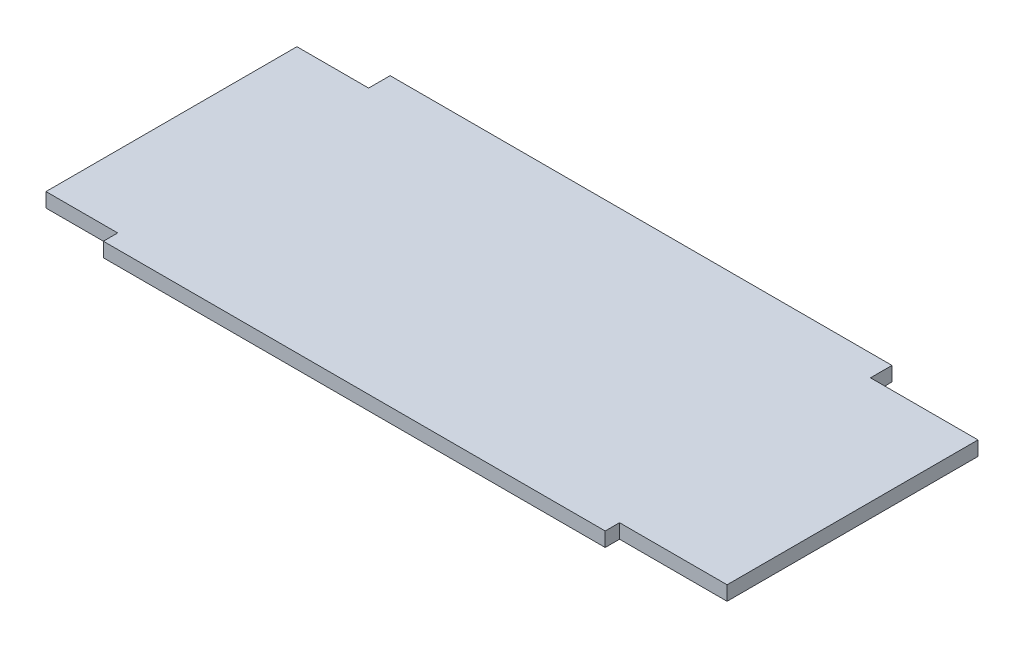
ISO-10303-21;
HEADER;
FILE_DESCRIPTION(('STEP AP214'),'2;1');
FILE_NAME('part.step','',(''),(''),'','','');
FILE_SCHEMA(('AUTOMOTIVE_DESIGN { 1 0 10303 214 1 1 1 1 }'));
ENDSEC;
DATA;
#1=APPLICATION_CONTEXT('core data for automotive mechanical design processes');
#2=APPLICATION_PROTOCOL_DEFINITION('international standard','automotive_design',2000,#1);
#3=PRODUCT_CONTEXT('',#1,'mechanical');
#4=PRODUCT('Part','Part','',(#3));
#5=PRODUCT_RELATED_PRODUCT_CATEGORY('part','',(#4));
#6=PRODUCT_DEFINITION_FORMATION('','',#4);
#7=PRODUCT_DEFINITION_CONTEXT('part definition',#1,'design');
#8=PRODUCT_DEFINITION('design','',#6,#7);
#9=PRODUCT_DEFINITION_SHAPE('','',#8);
#10=(LENGTH_UNIT() NAMED_UNIT(*) SI_UNIT(.MILLI.,.METRE.));
#11=(NAMED_UNIT(*) PLANE_ANGLE_UNIT() SI_UNIT($,.RADIAN.));
#12=(NAMED_UNIT(*) SI_UNIT($,.STERADIAN.) SOLID_ANGLE_UNIT());
#13=UNCERTAINTY_MEASURE_WITH_UNIT(LENGTH_MEASURE(1.E-05),#10,'distance_accuracy_value','');
#14=(GEOMETRIC_REPRESENTATION_CONTEXT(3) GLOBAL_UNCERTAINTY_ASSIGNED_CONTEXT((#13)) GLOBAL_UNIT_ASSIGNED_CONTEXT((#10,
#11,#12)) REPRESENTATION_CONTEXT('',''));
#15=CARTESIAN_POINT('',(0.,0.,0.));
#16=DIRECTION('',(0.,0.,1.));
#17=DIRECTION('',(1.,0.,0.));
#18=AXIS2_PLACEMENT_3D('',#15,#16,#17);
#19=CARTESIAN_POINT('',(78.,-72.5,107.028565600046));
#20=DIRECTION('',(1.,0.,0.));
#21=DIRECTION('',(0.,0.,-1.));
#22=AXIS2_PLACEMENT_3D('',#19,#20,#21);
#23=PLANE('',#22);
#24=DIRECTION('',(0.,-1.,0.));
#25=VECTOR('',#24,1.);
#26=CARTESIAN_POINT('',(78.,-72.5,0.));
#27=LINE('',#26,#25);
#28=CARTESIAN_POINT('',(78.,-72.5,0.));
#29=VERTEX_POINT('',#28);
#30=CARTESIAN_POINT('',(78.,-74.5,0.));
#31=VERTEX_POINT('',#30);
#32=EDGE_CURVE('E156',#29,#31,#27,.T.);
#33=ORIENTED_EDGE('',*,*,#32,.F.);
#34=DIRECTION('',(0.,0.,-1.));
#35=VECTOR('',#34,1.);
#36=CARTESIAN_POINT('',(78.,-72.5,107.028565600046));
#37=LINE('',#36,#35);
#38=CARTESIAN_POINT('',(78.,-72.5,-3.));
#39=VERTEX_POINT('',#38);
#40=EDGE_CURVE('E196',#29,#39,#37,.T.);
#41=ORIENTED_EDGE('',*,*,#40,.T.);
#42=DIRECTION('',(0.,1.,0.));
#43=VECTOR('',#42,1.);
#44=CARTESIAN_POINT('',(78.,-72.5,-3.));
#45=LINE('',#44,#43);
#46=CARTESIAN_POINT('',(78.,-74.5,-3.));
#47=VERTEX_POINT('',#46);
#48=EDGE_CURVE('E206',#47,#39,#45,.T.);
#49=ORIENTED_EDGE('',*,*,#48,.F.);
#50=DIRECTION('',(0.,0.,-1.));
#51=VECTOR('',#50,1.);
#52=CARTESIAN_POINT('',(78.,-74.5,107.028565600046));
#53=LINE('',#52,#51);
#54=EDGE_CURVE('E56',#31,#47,#53,.T.);
#55=ORIENTED_EDGE('',*,*,#54,.F.);
#56=EDGE_LOOP('',(#33,#41,#49,#55));
#57=FACE_BOUND('',#56,.T.);
#58=ADVANCED_FACE('F39',(#57),#23,.F.);
#59=DIRECTION('',(0.,1.,0.));
#60=VECTOR('',#59,1.);
#61=CARTESIAN_POINT('',(78.,-72.5,35.));
#62=LINE('',#61,#60);
#63=CARTESIAN_POINT('',(78.,-74.5,35.));
#64=VERTEX_POINT('',#63);
#65=CARTESIAN_POINT('',(78.,-72.5,35.));
#66=VERTEX_POINT('',#65);
#67=EDGE_CURVE('E64',#64,#66,#62,.T.);
#68=ORIENTED_EDGE('',*,*,#67,.F.);
#69=CARTESIAN_POINT('',(78.,-74.5,37.));
#70=VERTEX_POINT('',#69);
#71=EDGE_CURVE('E210',#70,#64,#53,.T.);
#72=ORIENTED_EDGE('',*,*,#71,.F.);
#73=DIRECTION('',(0.,-1.,0.));
#74=VECTOR('',#73,1.);
#75=CARTESIAN_POINT('',(78.,-72.5,37.));
#76=LINE('',#75,#74);
#77=CARTESIAN_POINT('',(78.,-72.5,37.));
#78=VERTEX_POINT('',#77);
#79=EDGE_CURVE('E230',#78,#70,#76,.T.);
#80=ORIENTED_EDGE('',*,*,#79,.F.);
#81=EDGE_CURVE('E200',#78,#66,#37,.T.);
#82=ORIENTED_EDGE('',*,*,#81,.T.);
#83=EDGE_LOOP('',(#68,#72,#80,#82));
#84=FACE_BOUND('',#83,.T.);
#85=ADVANCED_FACE('F299',(#84),#23,.F.);
#86=CARTESIAN_POINT('',(148.,-72.5,107.028565600046));
#87=DIRECTION('',(-1.,0.,0.));
#88=DIRECTION('',(0.,0.,1.));
#89=AXIS2_PLACEMENT_3D('',#86,#87,#88);
#90=PLANE('',#89);
#91=DIRECTION('',(0.,1.,0.));
#92=VECTOR('',#91,1.);
#93=CARTESIAN_POINT('',(148.,-72.5,0.));
#94=LINE('',#93,#92);
#95=CARTESIAN_POINT('',(148.,-74.5,0.));
#96=VERTEX_POINT('',#95);
#97=CARTESIAN_POINT('',(148.,-72.5,0.));
#98=VERTEX_POINT('',#97);
#99=EDGE_CURVE('E157',#96,#98,#94,.T.);
#100=ORIENTED_EDGE('',*,*,#99,.F.);
#101=DIRECTION('',(0.,0.,-1.));
#102=VECTOR('',#101,1.);
#103=CARTESIAN_POINT('',(148.,-74.5,107.028565600046));
#104=LINE('',#103,#102);
#105=CARTESIAN_POINT('',(148.,-74.5,-3.));
#106=VERTEX_POINT('',#105);
#107=EDGE_CURVE('E220',#96,#106,#104,.T.);
#108=ORIENTED_EDGE('',*,*,#107,.T.);
#109=DIRECTION('',(0.,-1.,0.));
#110=VECTOR('',#109,1.);
#111=CARTESIAN_POINT('',(148.,-72.5,-3.));
#112=LINE('',#111,#110);
#113=CARTESIAN_POINT('',(148.,-72.5,-3.));
#114=VERTEX_POINT('',#113);
#115=EDGE_CURVE('E239',#114,#106,#112,.T.);
#116=ORIENTED_EDGE('',*,*,#115,.F.);
#117=DIRECTION('',(0.,0.,-1.));
#118=VECTOR('',#117,1.);
#119=CARTESIAN_POINT('',(148.,-72.5,107.028565600046));
#120=LINE('',#119,#118);
#121=EDGE_CURVE('E219',#98,#114,#120,.T.);
#122=ORIENTED_EDGE('',*,*,#121,.F.);
#123=EDGE_LOOP('',(#100,#108,#116,#122));
#124=FACE_BOUND('',#123,.T.);
#125=ADVANCED_FACE('F303',(#124),#90,.F.);
#126=DIRECTION('',(0.,-1.,0.));
#127=VECTOR('',#126,1.);
#128=CARTESIAN_POINT('',(148.,-72.5,35.));
#129=LINE('',#128,#127);
#130=CARTESIAN_POINT('',(148.,-72.5,35.));
#131=VERTEX_POINT('',#130);
#132=CARTESIAN_POINT('',(148.,-74.5,35.));
#133=VERTEX_POINT('',#132);
#134=EDGE_CURVE('E161',#131,#133,#129,.T.);
#135=ORIENTED_EDGE('',*,*,#134,.F.);
#136=CARTESIAN_POINT('',(148.,-72.5,37.));
#137=VERTEX_POINT('',#136);
#138=EDGE_CURVE('E231',#137,#131,#120,.T.);
#139=ORIENTED_EDGE('',*,*,#138,.F.);
#140=DIRECTION('',(0.,1.,0.));
#141=VECTOR('',#140,1.);
#142=CARTESIAN_POINT('',(148.,-72.5,37.));
#143=LINE('',#142,#141);
#144=CARTESIAN_POINT('',(148.,-74.5,37.));
#145=VERTEX_POINT('',#144);
#146=EDGE_CURVE('E11',#145,#137,#143,.T.);
#147=ORIENTED_EDGE('',*,*,#146,.F.);
#148=EDGE_CURVE('E216',#145,#133,#104,.T.);
#149=ORIENTED_EDGE('',*,*,#148,.T.);
#150=EDGE_LOOP('',(#135,#139,#147,#149));
#151=FACE_BOUND('',#150,.T.);
#152=ADVANCED_FACE('F307',(#151),#90,.F.);
#153=CARTESIAN_POINT('',(78.,-74.5,107.028565600046));
#154=DIRECTION('',(0.,1.,0.));
#155=DIRECTION('',(0.,0.,1.));
#156=AXIS2_PLACEMENT_3D('',#153,#154,#155);
#157=PLANE('',#156);
#158=DIRECTION('',(1.,0.,0.));
#159=VECTOR('',#158,1.);
#160=CARTESIAN_POINT('',(78.,-74.5,37.));
#161=LINE('',#160,#159);
#162=EDGE_CURVE('E48',#70,#145,#161,.T.);
#163=ORIENTED_EDGE('',*,*,#162,.F.);
#164=ORIENTED_EDGE('',*,*,#71,.T.);
#165=DIRECTION('',(1.,0.,0.));
#166=VECTOR('',#165,1.);
#167=CARTESIAN_POINT('',(68.,-74.5,35.));
#168=LINE('',#167,#166);
#169=CARTESIAN_POINT('',(68.,-74.5,35.));
#170=VERTEX_POINT('',#169);
#171=EDGE_CURVE('E141',#170,#64,#168,.T.);
#172=ORIENTED_EDGE('',*,*,#171,.F.);
#173=DIRECTION('',(0.,0.,1.));
#174=VECTOR('',#173,1.);
#175=CARTESIAN_POINT('',(68.,-74.5,0.));
#176=LINE('',#175,#174);
#177=CARTESIAN_POINT('',(68.,-74.5,0.));
#178=VERTEX_POINT('',#177);
#179=EDGE_CURVE('E134',#178,#170,#176,.T.);
#180=ORIENTED_EDGE('',*,*,#179,.F.);
#181=DIRECTION('',(1.,0.,0.));
#182=VECTOR('',#181,1.);
#183=CARTESIAN_POINT('',(68.,-74.5,0.));
#184=LINE('',#183,#182);
#185=EDGE_CURVE('E138',#178,#31,#184,.T.);
#186=ORIENTED_EDGE('',*,*,#185,.T.);
#187=ORIENTED_EDGE('',*,*,#54,.T.);
#188=DIRECTION('',(-1.,0.,0.));
#189=VECTOR('',#188,1.);
#190=CARTESIAN_POINT('',(78.,-74.5,-3.));
#191=LINE('',#190,#189);
#192=EDGE_CURVE('E201',#106,#47,#191,.T.);
#193=ORIENTED_EDGE('',*,*,#192,.F.);
#194=ORIENTED_EDGE('',*,*,#107,.F.);
#195=DIRECTION('',(-1.,0.,0.));
#196=VECTOR('',#195,1.);
#197=CARTESIAN_POINT('',(163.,-74.5,0.));
#198=LINE('',#197,#196);
#199=CARTESIAN_POINT('',(163.,-74.5,0.));
#200=VERTEX_POINT('',#199);
#201=EDGE_CURVE('E256',#200,#96,#198,.T.);
#202=ORIENTED_EDGE('',*,*,#201,.F.);
#203=DIRECTION('',(0.,0.,-1.));
#204=VECTOR('',#203,1.);
#205=CARTESIAN_POINT('',(163.,-74.5,0.));
#206=LINE('',#205,#204);
#207=CARTESIAN_POINT('',(163.,-74.5,35.));
#208=VERTEX_POINT('',#207);
#209=EDGE_CURVE('E270',#208,#200,#206,.T.);
#210=ORIENTED_EDGE('',*,*,#209,.F.);
#211=DIRECTION('',(-1.,0.,0.));
#212=VECTOR('',#211,1.);
#213=CARTESIAN_POINT('',(163.,-74.5,35.));
#214=LINE('',#213,#212);
#215=EDGE_CURVE('E252',#208,#133,#214,.T.);
#216=ORIENTED_EDGE('',*,*,#215,.T.);
#217=ORIENTED_EDGE('',*,*,#148,.F.);
#218=EDGE_LOOP('',(#163,#164,#172,#180,#186,#187,#193,#194,#202,#210,#216,#217));
#219=FACE_BOUND('',#218,.T.);
#220=ADVANCED_FACE('F136',(#219),#157,.F.);
#221=CARTESIAN_POINT('',(78.,-72.5,107.028565600046));
#222=DIRECTION('',(0.,-1.,0.));
#223=DIRECTION('',(1.,0.,0.));
#224=AXIS2_PLACEMENT_3D('',#221,#222,#223);
#225=PLANE('',#224);
#226=DIRECTION('',(-1.,0.,0.));
#227=VECTOR('',#226,1.);
#228=CARTESIAN_POINT('',(78.,-72.5,37.));
#229=LINE('',#228,#227);
#230=EDGE_CURVE('E226',#137,#78,#229,.T.);
#231=ORIENTED_EDGE('',*,*,#230,.F.);
#232=ORIENTED_EDGE('',*,*,#138,.T.);
#233=DIRECTION('',(-1.,0.,0.));
#234=VECTOR('',#233,1.);
#235=CARTESIAN_POINT('',(163.,-72.5,35.));
#236=LINE('',#235,#234);
#237=CARTESIAN_POINT('',(163.,-72.5,35.));
#238=VERTEX_POINT('',#237);
#239=EDGE_CURVE('E255',#238,#131,#236,.T.);
#240=ORIENTED_EDGE('',*,*,#239,.F.);
#241=DIRECTION('',(0.,0.,1.));
#242=VECTOR('',#241,1.);
#243=CARTESIAN_POINT('',(163.,-72.5,0.));
#244=LINE('',#243,#242);
#245=CARTESIAN_POINT('',(163.,-72.5,0.));
#246=VERTEX_POINT('',#245);
#247=EDGE_CURVE('E279',#246,#238,#244,.T.);
#248=ORIENTED_EDGE('',*,*,#247,.F.);
#249=DIRECTION('',(-1.,0.,0.));
#250=VECTOR('',#249,1.);
#251=CARTESIAN_POINT('',(163.,-72.5,0.));
#252=LINE('',#251,#250);
#253=EDGE_CURVE('E243',#246,#98,#252,.T.);
#254=ORIENTED_EDGE('',*,*,#253,.T.);
#255=ORIENTED_EDGE('',*,*,#121,.T.);
#256=DIRECTION('',(1.,0.,0.));
#257=VECTOR('',#256,1.);
#258=CARTESIAN_POINT('',(78.,-72.5,-3.));
#259=LINE('',#258,#257);
#260=EDGE_CURVE('E198',#39,#114,#259,.T.);
#261=ORIENTED_EDGE('',*,*,#260,.F.);
#262=ORIENTED_EDGE('',*,*,#40,.F.);
#263=DIRECTION('',(1.,0.,0.));
#264=VECTOR('',#263,1.);
#265=CARTESIAN_POINT('',(68.,-72.5,0.));
#266=LINE('',#265,#264);
#267=CARTESIAN_POINT('',(68.,-72.5,0.));
#268=VERTEX_POINT('',#267);
#269=EDGE_CURVE('E171',#268,#29,#266,.T.);
#270=ORIENTED_EDGE('',*,*,#269,.F.);
#271=DIRECTION('',(0.,0.,-1.));
#272=VECTOR('',#271,1.);
#273=CARTESIAN_POINT('',(68.,-72.5,0.));
#274=LINE('',#273,#272);
#275=CARTESIAN_POINT('',(68.,-72.5,35.));
#276=VERTEX_POINT('',#275);
#277=EDGE_CURVE('E150',#276,#268,#274,.T.);
#278=ORIENTED_EDGE('',*,*,#277,.F.);
#279=DIRECTION('',(1.,0.,0.));
#280=VECTOR('',#279,1.);
#281=CARTESIAN_POINT('',(68.,-72.5,35.));
#282=LINE('',#281,#280);
#283=EDGE_CURVE('E163',#276,#66,#282,.T.);
#284=ORIENTED_EDGE('',*,*,#283,.T.);
#285=ORIENTED_EDGE('',*,*,#81,.F.);
#286=EDGE_LOOP('',(#231,#232,#240,#248,#254,#255,#261,#262,#270,#278,#284,#285));
#287=FACE_BOUND('',#286,.T.);
#288=ADVANCED_FACE('F193',(#287),#225,.F.);
#289=CARTESIAN_POINT('',(144.,0.,37.));
#290=DIRECTION('',(0.,0.,1.));
#291=DIRECTION('',(-1.,0.,0.));
#292=AXIS2_PLACEMENT_3D('',#289,#290,#291);
#293=PLANE('',#292);
#294=ORIENTED_EDGE('',*,*,#230,.T.);
#295=ORIENTED_EDGE('',*,*,#79,.T.);
#296=ORIENTED_EDGE('',*,*,#162,.T.);
#297=ORIENTED_EDGE('',*,*,#146,.T.);
#298=EDGE_LOOP('',(#294,#295,#296,#297));
#299=FACE_BOUND('',#298,.T.);
#300=ADVANCED_FACE('F41',(#299),#293,.T.);
#301=CARTESIAN_POINT('',(0.,0.,-3.));
#302=DIRECTION('',(0.,0.,1.));
#303=DIRECTION('',(0.,-1.,0.));
#304=AXIS2_PLACEMENT_3D('',#301,#302,#303);
#305=PLANE('',#304);
#306=ORIENTED_EDGE('',*,*,#48,.T.);
#307=ORIENTED_EDGE('',*,*,#260,.T.);
#308=ORIENTED_EDGE('',*,*,#115,.T.);
#309=ORIENTED_EDGE('',*,*,#192,.T.);
#310=EDGE_LOOP('',(#306,#307,#308,#309));
#311=FACE_BOUND('',#310,.T.);
#312=ADVANCED_FACE('F297',(#311),#305,.F.);
#313=CARTESIAN_POINT('',(163.,-72.5,0.));
#314=DIRECTION('',(0.,0.,1.));
#315=DIRECTION('',(0.,-1.,0.));
#316=AXIS2_PLACEMENT_3D('',#313,#314,#315);
#317=PLANE('',#316);
#318=ORIENTED_EDGE('',*,*,#99,.T.);
#319=ORIENTED_EDGE('',*,*,#253,.F.);
#320=DIRECTION('',(0.,1.,0.));
#321=VECTOR('',#320,1.);
#322=CARTESIAN_POINT('',(163.,-72.5,0.));
#323=LINE('',#322,#321);
#324=EDGE_CURVE('E178',#200,#246,#323,.T.);
#325=ORIENTED_EDGE('',*,*,#324,.F.);
#326=ORIENTED_EDGE('',*,*,#201,.T.);
#327=EDGE_LOOP('',(#318,#319,#325,#326));
#328=FACE_BOUND('',#327,.T.);
#329=ADVANCED_FACE('F284',(#328),#317,.F.);
#330=CARTESIAN_POINT('',(163.,-72.5,35.));
#331=DIRECTION('',(0.,0.,-1.));
#332=DIRECTION('',(-1.,0.,0.));
#333=AXIS2_PLACEMENT_3D('',#330,#331,#332);
#334=PLANE('',#333);
#335=ORIENTED_EDGE('',*,*,#134,.T.);
#336=ORIENTED_EDGE('',*,*,#215,.F.);
#337=DIRECTION('',(0.,-1.,0.));
#338=VECTOR('',#337,1.);
#339=CARTESIAN_POINT('',(163.,-72.5,35.));
#340=LINE('',#339,#338);
#341=EDGE_CURVE('E275',#238,#208,#340,.T.);
#342=ORIENTED_EDGE('',*,*,#341,.F.);
#343=ORIENTED_EDGE('',*,*,#239,.T.);
#344=EDGE_LOOP('',(#335,#336,#342,#343));
#345=FACE_BOUND('',#344,.T.);
#346=ADVANCED_FACE('F289',(#345),#334,.F.);
#347=CARTESIAN_POINT('',(163.,0.,0.));
#348=DIRECTION('',(-1.,0.,0.));
#349=DIRECTION('',(0.,0.,1.));
#350=AXIS2_PLACEMENT_3D('',#347,#348,#349);
#351=PLANE('',#350);
#352=ORIENTED_EDGE('',*,*,#324,.T.);
#353=ORIENTED_EDGE('',*,*,#247,.T.);
#354=ORIENTED_EDGE('',*,*,#341,.T.);
#355=ORIENTED_EDGE('',*,*,#209,.T.);
#356=EDGE_LOOP('',(#352,#353,#354,#355));
#357=FACE_BOUND('',#356,.T.);
#358=ADVANCED_FACE('F283',(#357),#351,.F.);
#359=CARTESIAN_POINT('',(68.,-72.5,0.));
#360=DIRECTION('',(0.,0.,1.));
#361=DIRECTION('',(0.,-1.,0.));
#362=AXIS2_PLACEMENT_3D('',#359,#360,#361);
#363=PLANE('',#362);
#364=ORIENTED_EDGE('',*,*,#32,.T.);
#365=ORIENTED_EDGE('',*,*,#185,.F.);
#366=DIRECTION('',(0.,-1.,0.));
#367=VECTOR('',#366,1.);
#368=CARTESIAN_POINT('',(68.,-72.5,0.));
#369=LINE('',#368,#367);
#370=EDGE_CURVE('E145',#268,#178,#369,.T.);
#371=ORIENTED_EDGE('',*,*,#370,.F.);
#372=ORIENTED_EDGE('',*,*,#269,.T.);
#373=EDGE_LOOP('',(#364,#365,#371,#372));
#374=FACE_BOUND('',#373,.T.);
#375=ADVANCED_FACE('F155',(#374),#363,.F.);
#376=CARTESIAN_POINT('',(68.,-72.5,35.));
#377=DIRECTION('',(0.,0.,-1.));
#378=DIRECTION('',(-1.,0.,0.));
#379=AXIS2_PLACEMENT_3D('',#376,#377,#378);
#380=PLANE('',#379);
#381=ORIENTED_EDGE('',*,*,#67,.T.);
#382=ORIENTED_EDGE('',*,*,#283,.F.);
#383=DIRECTION('',(0.,1.,0.));
#384=VECTOR('',#383,1.);
#385=CARTESIAN_POINT('',(68.,-72.5,35.));
#386=LINE('',#385,#384);
#387=EDGE_CURVE('E144',#170,#276,#386,.T.);
#388=ORIENTED_EDGE('',*,*,#387,.F.);
#389=ORIENTED_EDGE('',*,*,#171,.T.);
#390=EDGE_LOOP('',(#381,#382,#388,#389));
#391=FACE_BOUND('',#390,.T.);
#392=ADVANCED_FACE('F191',(#391),#380,.F.);
#393=CARTESIAN_POINT('',(68.,0.,0.));
#394=DIRECTION('',(-1.,0.,0.));
#395=DIRECTION('',(0.,0.,1.));
#396=AXIS2_PLACEMENT_3D('',#393,#394,#395);
#397=PLANE('',#396);
#398=ORIENTED_EDGE('',*,*,#370,.T.);
#399=ORIENTED_EDGE('',*,*,#179,.T.);
#400=ORIENTED_EDGE('',*,*,#387,.T.);
#401=ORIENTED_EDGE('',*,*,#277,.T.);
#402=EDGE_LOOP('',(#398,#399,#400,#401));
#403=FACE_BOUND('',#402,.T.);
#404=ADVANCED_FACE('F148',(#403),#397,.T.);
#405=CLOSED_SHELL('',(#58,#85,#125,#152,#220,#288,#300,#312,#329,#346,#358,#375,#392,#404));
#406=MANIFOLD_SOLID_BREP('B2',#405);
#407=ADVANCED_BREP_SHAPE_REPRESENTATION('',(#18,#406),#14);
#408=SHAPE_DEFINITION_REPRESENTATION(#9,#407);
ENDSEC;
END-ISO-10303-21;
